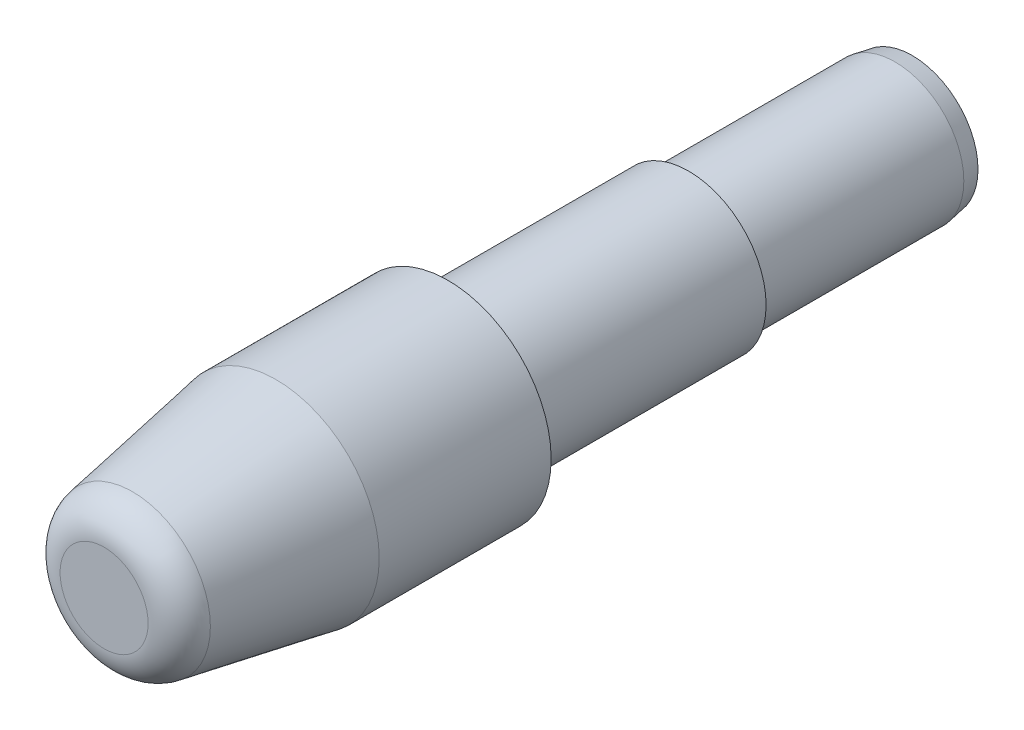
ISO-10303-21;
HEADER;
FILE_DESCRIPTION(('STEP AP214'),'2;1');
FILE_NAME('part.step','',(''),(''),'','','');
FILE_SCHEMA(('AUTOMOTIVE_DESIGN { 1 0 10303 214 1 1 1 1 }'));
ENDSEC;
DATA;
#1=APPLICATION_CONTEXT('core data for automotive mechanical design processes');
#2=APPLICATION_PROTOCOL_DEFINITION('international standard','automotive_design',2000,#1);
#3=PRODUCT_CONTEXT('',#1,'mechanical');
#4=PRODUCT('Part','Part','',(#3));
#5=PRODUCT_RELATED_PRODUCT_CATEGORY('part','',(#4));
#6=PRODUCT_DEFINITION_FORMATION('','',#4);
#7=PRODUCT_DEFINITION_CONTEXT('part definition',#1,'design');
#8=PRODUCT_DEFINITION('design','',#6,#7);
#9=PRODUCT_DEFINITION_SHAPE('','',#8);
#10=(LENGTH_UNIT() NAMED_UNIT(*) SI_UNIT(.MILLI.,.METRE.));
#11=(NAMED_UNIT(*) PLANE_ANGLE_UNIT() SI_UNIT($,.RADIAN.));
#12=(NAMED_UNIT(*) SI_UNIT($,.STERADIAN.) SOLID_ANGLE_UNIT());
#13=UNCERTAINTY_MEASURE_WITH_UNIT(LENGTH_MEASURE(1.E-05),#10,'distance_accuracy_value','');
#14=(GEOMETRIC_REPRESENTATION_CONTEXT(3) GLOBAL_UNCERTAINTY_ASSIGNED_CONTEXT((#13)) GLOBAL_UNIT_ASSIGNED_CONTEXT((#10,
#11,#12)) REPRESENTATION_CONTEXT('',''));
#15=CARTESIAN_POINT('',(0.,0.,0.));
#16=DIRECTION('',(0.,0.,1.));
#17=DIRECTION('',(1.,0.,0.));
#18=AXIS2_PLACEMENT_3D('',#15,#16,#17);
#19=CARTESIAN_POINT('',(0.,0.,-14.));
#20=DIRECTION('',(0.,0.,-1.));
#21=DIRECTION('',(-1.,0.,0.));
#22=AXIS2_PLACEMENT_3D('',#19,#20,#21);
#23=PLANE('',#22);
#24=CARTESIAN_POINT('',(0.,0.,-14.));
#25=DIRECTION('',(0.,0.,-1.));
#26=DIRECTION('',(-1.,0.,0.));
#27=AXIS2_PLACEMENT_3D('',#24,#25,#26);
#28=CIRCLE('',#27,4.5);
#29=CARTESIAN_POINT('',(-4.5,0.,-14.));
#30=VERTEX_POINT('',#29);
#31=EDGE_CURVE('E60',#30,#30,#28,.T.);
#32=ORIENTED_EDGE('',*,*,#31,.T.);
#33=EDGE_LOOP('',(#32));
#34=FACE_BOUND('',#33,.T.);
#35=CARTESIAN_POINT('',(0.,0.,-14.));
#36=DIRECTION('',(0.,0.,-1.));
#37=DIRECTION('',(-1.,0.,0.));
#38=AXIS2_PLACEMENT_3D('',#35,#36,#37);
#39=CIRCLE('',#38,4.);
#40=CARTESIAN_POINT('',(4.,0.,-14.));
#41=VERTEX_POINT('',#40);
#42=EDGE_CURVE('E63',#41,#41,#39,.T.);
#43=ORIENTED_EDGE('',*,*,#42,.F.);
#44=EDGE_LOOP('',(#43));
#45=FACE_BOUND('',#44,.T.);
#46=ADVANCED_FACE('F31',(#34,#45),#23,.T.);
#47=CARTESIAN_POINT('',(0.,0.,0.));
#48=DIRECTION('',(0.,0.,1.));
#49=DIRECTION('',(1.,0.,0.));
#50=AXIS2_PLACEMENT_3D('',#47,#48,#49);
#51=PLANE('',#50);
#52=CARTESIAN_POINT('',(0.,0.,0.));
#53=DIRECTION('',(0.,0.,1.));
#54=DIRECTION('',(1.,0.,0.));
#55=AXIS2_PLACEMENT_3D('',#52,#53,#54);
#56=CIRCLE('',#55,6.);
#57=CARTESIAN_POINT('',(6.,0.,0.));
#58=VERTEX_POINT('',#57);
#59=EDGE_CURVE('E57',#58,#58,#56,.T.);
#60=ORIENTED_EDGE('',*,*,#59,.F.);
#61=EDGE_LOOP('',(#60));
#62=FACE_BOUND('',#61,.T.);
#63=CARTESIAN_POINT('',(0.,0.,0.));
#64=DIRECTION('',(0.,0.,1.));
#65=DIRECTION('',(1.,0.,0.));
#66=AXIS2_PLACEMENT_3D('',#63,#64,#65);
#67=CIRCLE('',#66,4.5);
#68=CARTESIAN_POINT('',(4.5,0.,0.));
#69=VERTEX_POINT('',#68);
#70=EDGE_CURVE('E42',#69,#69,#67,.F.);
#71=ORIENTED_EDGE('',*,*,#70,.F.);
#72=EDGE_LOOP('',(#71));
#73=FACE_BOUND('',#72,.T.);
#74=ADVANCED_FACE('F70',(#62,#73),#51,.F.);
#75=CARTESIAN_POINT('',(0.,0.,10.));
#76=DIRECTION('',(0.,0.,-1.));
#77=DIRECTION('',(-1.,0.,0.));
#78=AXIS2_PLACEMENT_3D('',#75,#76,#77);
#79=CYLINDRICAL_SURFACE('',#78,6.);
#80=CARTESIAN_POINT('',(0.,0.,9.99999999999982));
#81=DIRECTION('',(0.,0.,1.));
#82=DIRECTION('',(1.,0.,0.));
#83=AXIS2_PLACEMENT_3D('',#80,#81,#82);
#84=CIRCLE('',#83,6.);
#85=CARTESIAN_POINT('',(6.,0.,9.99999999999982));
#86=VERTEX_POINT('',#85);
#87=EDGE_CURVE('E54',#86,#86,#84,.F.);
#88=ORIENTED_EDGE('',*,*,#87,.T.);
#89=EDGE_LOOP('',(#88));
#90=FACE_BOUND('',#89,.T.);
#91=ORIENTED_EDGE('',*,*,#59,.T.);
#92=EDGE_LOOP('',(#91));
#93=FACE_BOUND('',#92,.T.);
#94=ADVANCED_FACE('F76',(#90,#93),#79,.T.);
#95=CARTESIAN_POINT('',(0.,0.,20.));
#96=DIRECTION('',(0.,0.,1.));
#97=DIRECTION('',(1.,0.,0.));
#98=AXIS2_PLACEMENT_3D('',#95,#96,#97);
#99=PLANE('',#98);
#100=CARTESIAN_POINT('',(0.,0.,20.));
#101=DIRECTION('',(0.,0.,1.));
#102=DIRECTION('',(1.,0.,0.));
#103=AXIS2_PLACEMENT_3D('',#100,#101,#102);
#104=CIRCLE('',#103,2.55853093056079);
#105=CARTESIAN_POINT('',(2.55853093056079,0.,20.));
#106=VERTEX_POINT('',#105);
#107=EDGE_CURVE('E51',#106,#106,#104,.T.);
#108=ORIENTED_EDGE('',*,*,#107,.T.);
#109=EDGE_LOOP('',(#108));
#110=FACE_BOUND('',#109,.T.);
#111=ADVANCED_FACE('F87',(#110),#99,.T.);
#112=CARTESIAN_POINT('',(0.,0.,20.));
#113=DIRECTION('',(0.,0.,-1.));
#114=DIRECTION('',(-1.,0.,0.));
#115=AXIS2_PLACEMENT_3D('',#112,#113,#114);
#116=CONICAL_SURFACE('',#115,4.23673019291535,0.17453292519943);
#117=CARTESIAN_POINT('',(0.,0.,18.3472963553339));
#118=DIRECTION('',(0.,0.,1.));
#119=DIRECTION('',(1.,0.,0.));
#120=AXIS2_PLACEMENT_3D('',#117,#118,#119);
#121=CIRCLE('',#120,4.5281464365852);
#122=CARTESIAN_POINT('',(4.5281464365852,0.,18.3472963553339));
#123=VERTEX_POINT('',#122);
#124=EDGE_CURVE('E46',#123,#123,#121,.F.);
#125=ORIENTED_EDGE('',*,*,#124,.T.);
#126=EDGE_LOOP('',(#125));
#127=FACE_BOUND('',#126,.T.);
#128=ORIENTED_EDGE('',*,*,#87,.F.);
#129=EDGE_LOOP('',(#128));
#130=FACE_BOUND('',#129,.T.);
#131=ADVANCED_FACE('F89',(#127,#130),#116,.T.);
#132=CARTESIAN_POINT('',(0.,0.,18.));
#133=DIRECTION('',(0.,0.,1.));
#134=DIRECTION('',(1.,0.,0.));
#135=AXIS2_PLACEMENT_3D('',#132,#133,#134);
#136=TOROIDAL_SURFACE('',#135,2.55853093056079,2.);
#137=ORIENTED_EDGE('',*,*,#124,.F.);
#138=EDGE_LOOP('',(#137));
#139=FACE_BOUND('',#138,.T.);
#140=ORIENTED_EDGE('',*,*,#107,.F.);
#141=EDGE_LOOP('',(#140));
#142=FACE_BOUND('',#141,.T.);
#143=ADVANCED_FACE('F85',(#139,#142),#136,.T.);
#144=CARTESIAN_POINT('',(0.,0.,-14.));
#145=DIRECTION('',(0.,0.,1.));
#146=DIRECTION('',(1.,0.,0.));
#147=AXIS2_PLACEMENT_3D('',#144,#145,#146);
#148=CYLINDRICAL_SURFACE('',#147,4.5);
#149=ORIENTED_EDGE('',*,*,#31,.F.);
#150=EDGE_LOOP('',(#149));
#151=FACE_BOUND('',#150,.T.);
#152=ORIENTED_EDGE('',*,*,#70,.T.);
#153=EDGE_LOOP('',(#152));
#154=FACE_BOUND('',#153,.T.);
#155=ADVANCED_FACE('F82',(#151,#154),#148,.T.);
#156=CARTESIAN_POINT('',(0.,0.,-27.));
#157=DIRECTION('',(0.,0.,1.));
#158=DIRECTION('',(1.,0.,0.));
#159=AXIS2_PLACEMENT_3D('',#156,#157,#158);
#160=CYLINDRICAL_SURFACE('',#159,4.);
#161=CARTESIAN_POINT('',(0.,0.,-26.0000000000004));
#162=DIRECTION('',(0.,0.,-1.));
#163=DIRECTION('',(-1.,0.,0.));
#164=AXIS2_PLACEMENT_3D('',#161,#162,#163);
#165=CIRCLE('',#164,4.);
#166=CARTESIAN_POINT('',(4.,0.,-26.0000000000004));
#167=VERTEX_POINT('',#166);
#168=EDGE_CURVE('E10',#167,#167,#165,.F.);
#169=CARTESIAN_POINT('',(4.,0.,-26.0000000000004));
#170=CARTESIAN_POINT('',(4.,0.,-25.8750000000004));
#171=CARTESIAN_POINT('',(4.,0.,-25.7500000000004));
#172=CARTESIAN_POINT('',(4.,0.,-25.5000000000003));
#173=CARTESIAN_POINT('',(4.,0.,-25.3750000000003));
#174=CARTESIAN_POINT('',(4.,0.,-25.1250000000003));
#175=CARTESIAN_POINT('',(4.,0.,-25.0000000000003));
#176=CARTESIAN_POINT('',(4.,0.,-24.7500000000003));
#177=CARTESIAN_POINT('',(4.,0.,-24.6250000000003));
#178=CARTESIAN_POINT('',(4.,0.,-24.3750000000003));
#179=CARTESIAN_POINT('',(4.,0.,-24.2500000000003));
#180=CARTESIAN_POINT('',(4.,0.,-24.0000000000003));
#181=CARTESIAN_POINT('',(4.,0.,-23.8750000000003));
#182=CARTESIAN_POINT('',(4.,0.,-23.6250000000003));
#183=CARTESIAN_POINT('',(4.,0.,-23.5000000000003));
#184=CARTESIAN_POINT('',(4.,0.,-23.2500000000003));
#185=CARTESIAN_POINT('',(4.,0.,-23.1250000000003));
#186=CARTESIAN_POINT('',(4.,0.,-22.8750000000003));
#187=CARTESIAN_POINT('',(4.,0.,-22.7500000000003));
#188=CARTESIAN_POINT('',(4.,0.,-22.5000000000003));
#189=CARTESIAN_POINT('',(4.,0.,-22.3750000000003));
#190=CARTESIAN_POINT('',(4.,0.,-22.1250000000002));
#191=CARTESIAN_POINT('',(4.,0.,-22.0000000000002));
#192=CARTESIAN_POINT('',(4.,0.,-21.7500000000002));
#193=CARTESIAN_POINT('',(4.,0.,-21.6250000000002));
#194=CARTESIAN_POINT('',(4.,0.,-21.3750000000002));
#195=CARTESIAN_POINT('',(4.,0.,-21.2500000000002));
#196=CARTESIAN_POINT('',(4.,0.,-21.0000000000002));
#197=CARTESIAN_POINT('',(4.,0.,-20.8750000000002));
#198=CARTESIAN_POINT('',(4.,0.,-20.6250000000002));
#199=CARTESIAN_POINT('',(4.,0.,-20.5000000000002));
#200=CARTESIAN_POINT('',(4.,0.,-20.2500000000002));
#201=CARTESIAN_POINT('',(4.,0.,-20.1250000000002));
#202=CARTESIAN_POINT('',(4.,0.,-19.8750000000002));
#203=CARTESIAN_POINT('',(4.,0.,-19.7500000000002));
#204=CARTESIAN_POINT('',(4.,0.,-19.5000000000002));
#205=CARTESIAN_POINT('',(4.,0.,-19.3750000000002));
#206=CARTESIAN_POINT('',(4.,0.,-19.1250000000002));
#207=CARTESIAN_POINT('',(4.,0.,-19.0000000000002));
#208=CARTESIAN_POINT('',(4.,0.,-18.7500000000001));
#209=CARTESIAN_POINT('',(4.,0.,-18.6250000000001));
#210=CARTESIAN_POINT('',(4.,0.,-18.3750000000001));
#211=CARTESIAN_POINT('',(4.,0.,-18.2500000000001));
#212=CARTESIAN_POINT('',(4.,0.,-18.0000000000001));
#213=CARTESIAN_POINT('',(4.,0.,-17.8750000000001));
#214=CARTESIAN_POINT('',(4.,0.,-17.6250000000001));
#215=CARTESIAN_POINT('',(4.,0.,-17.5000000000001));
#216=CARTESIAN_POINT('',(4.,0.,-17.2500000000001));
#217=CARTESIAN_POINT('',(4.,0.,-17.1250000000001));
#218=CARTESIAN_POINT('',(4.,0.,-16.8750000000001));
#219=CARTESIAN_POINT('',(4.,0.,-16.7500000000001));
#220=CARTESIAN_POINT('',(4.,0.,-16.5000000000001));
#221=CARTESIAN_POINT('',(4.,0.,-16.3750000000001));
#222=CARTESIAN_POINT('',(4.,0.,-16.1250000000001));
#223=CARTESIAN_POINT('',(4.,0.,-16.0000000000001));
#224=CARTESIAN_POINT('',(4.,0.,-15.7500000000001));
#225=CARTESIAN_POINT('',(4.,0.,-15.625));
#226=CARTESIAN_POINT('',(4.,0.,-15.375));
#227=CARTESIAN_POINT('',(4.,0.,-15.25));
#228=CARTESIAN_POINT('',(4.,0.,-15.));
#229=CARTESIAN_POINT('',(4.,0.,-14.875));
#230=CARTESIAN_POINT('',(4.,0.,-14.625));
#231=CARTESIAN_POINT('',(4.,0.,-14.5));
#232=CARTESIAN_POINT('',(4.,0.,-14.25));
#233=CARTESIAN_POINT('',(4.,0.,-14.125));
#234=CARTESIAN_POINT('',(4.,0.,-14.));
#235=B_SPLINE_CURVE_WITH_KNOTS('',3,(#169,#170,#171,#172,#173,#174,#175,#176,#177,#178,#179,
#180,#181,#182,#183,#184,#185,#186,#187,#188,#189,#190,#191,#192,#193,#194,#195,#196,#197,#198,
#199,#200,#201,#202,#203,#204,#205,#206,#207,#208,#209,#210,#211,#212,#213,#214,#215,#216,#217,
#218,#219,#220,#221,#222,#223,#224,#225,#226,#227,#228,#229,#230,#231,#232,#233,#234),
.UNSPECIFIED.,.F.,.F.,(4,2,2,2,2,2,2,2,2,2,2,2,2,2,2,2,2,2,2,2,2,2,2,2,2,2,2,2,2,2,2,2,4),(0.,
0.375000000000011,0.750000000000022,1.12500000000003,1.50000000000004,1.87500000000005,
2.25000000000007,2.62500000000008,3.00000000000009,3.3750000000001,3.75000000000011,
4.12500000000012,4.50000000000013,4.87500000000015,5.25000000000016,5.62500000000017,
6.00000000000018,6.37500000000019,6.7500000000002,7.12500000000021,7.50000000000023,
7.87500000000023,8.25000000000025,8.62500000000026,9.00000000000027,9.37500000000028,
9.75000000000029,10.1250000000003,10.5000000000003,10.8750000000003,11.2500000000003,
11.6250000000003,12.0000000000004),.UNSPECIFIED.);
#236=EDGE_CURVE('BSEAM67',#167,#41,#235,.T.);
#237=ORIENTED_EDGE('',*,*,#168,.T.);
#238=ORIENTED_EDGE('',*,*,#42,.T.);
#239=ORIENTED_EDGE('',*,*,#236,.T.);
#240=ORIENTED_EDGE('',*,*,#236,.F.);
#241=EDGE_LOOP('',(#237,#239,#238,#240));
#242=FACE_BOUND('',#241,.T.);
#243=ADVANCED_FACE('F67',(#242),#160,.T.);
#244=CARTESIAN_POINT('',(0.,0.,-27.));
#245=DIRECTION('',(0.,0.,-1.));
#246=DIRECTION('',(-1.,0.,0.));
#247=AXIS2_PLACEMENT_3D('',#244,#245,#246);
#248=PLANE('',#247);
#249=CARTESIAN_POINT('',(0.,0.,-27.));
#250=DIRECTION('',(0.,0.,-1.));
#251=DIRECTION('',(-1.,0.,0.));
#252=AXIS2_PLACEMENT_3D('',#249,#250,#251);
#253=CIRCLE('',#252,3.8236730192916);
#254=CARTESIAN_POINT('',(-3.8236730192916,0.,-27.));
#255=VERTEX_POINT('',#254);
#256=EDGE_CURVE('E38',#255,#255,#253,.T.);
#257=ORIENTED_EDGE('',*,*,#256,.T.);
#258=EDGE_LOOP('',(#257));
#259=FACE_BOUND('',#258,.T.);
#260=ADVANCED_FACE('F124',(#259),#248,.T.);
#261=CARTESIAN_POINT('',(0.,0.,-27.));
#262=DIRECTION('',(0.,0.,1.));
#263=DIRECTION('',(1.,0.,0.));
#264=AXIS2_PLACEMENT_3D('',#261,#262,#263);
#265=CONICAL_SURFACE('',#264,3.8236730192916,0.17453292519943);
#266=ORIENTED_EDGE('',*,*,#168,.F.);
#267=EDGE_LOOP('',(#266));
#268=FACE_BOUND('',#267,.T.);
#269=ORIENTED_EDGE('',*,*,#256,.F.);
#270=EDGE_LOOP('',(#269));
#271=FACE_BOUND('',#270,.T.);
#272=ADVANCED_FACE('F33',(#268,#271),#265,.T.);
#273=CLOSED_SHELL('',(#46,#74,#94,#111,#131,#143,#155,#243,#260,#272));
#274=MANIFOLD_SOLID_BREP('B2',#273);
#275=ADVANCED_BREP_SHAPE_REPRESENTATION('',(#18,#274),#14);
#276=SHAPE_DEFINITION_REPRESENTATION(#9,#275);
ENDSEC;
END-ISO-10303-21;
